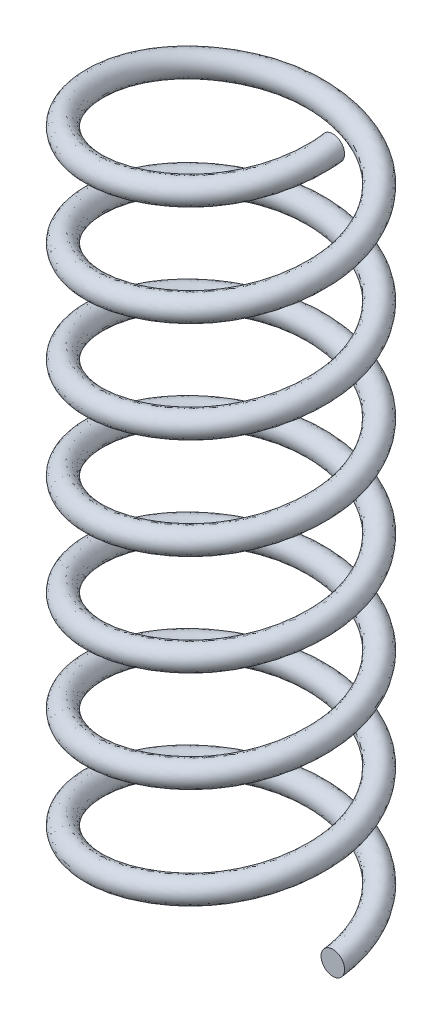
ISO-10303-21;
HEADER;
FILE_DESCRIPTION(('STEP AP214'),'2;1');
FILE_NAME('part.step','',(''),(''),'','','');
FILE_SCHEMA(('AUTOMOTIVE_DESIGN { 1 0 10303 214 1 1 1 1 }'));
ENDSEC;
DATA;
#1=APPLICATION_CONTEXT('core data for automotive mechanical design processes');
#2=APPLICATION_PROTOCOL_DEFINITION('international standard','automotive_design',2000,#1);
#3=PRODUCT_CONTEXT('',#1,'mechanical');
#4=PRODUCT('Part','Part','',(#3));
#5=PRODUCT_RELATED_PRODUCT_CATEGORY('part','',(#4));
#6=PRODUCT_DEFINITION_FORMATION('','',#4);
#7=PRODUCT_DEFINITION_CONTEXT('part definition',#1,'design');
#8=PRODUCT_DEFINITION('design','',#6,#7);
#9=PRODUCT_DEFINITION_SHAPE('','',#8);
#10=(LENGTH_UNIT() NAMED_UNIT(*) SI_UNIT(.MILLI.,.METRE.));
#11=(NAMED_UNIT(*) PLANE_ANGLE_UNIT() SI_UNIT($,.RADIAN.));
#12=(NAMED_UNIT(*) SI_UNIT($,.STERADIAN.) SOLID_ANGLE_UNIT());
#13=UNCERTAINTY_MEASURE_WITH_UNIT(LENGTH_MEASURE(1.E-05),#10,'distance_accuracy_value','');
#14=(GEOMETRIC_REPRESENTATION_CONTEXT(3) GLOBAL_UNCERTAINTY_ASSIGNED_CONTEXT((#13)) GLOBAL_UNIT_ASSIGNED_CONTEXT((#10,
#11,#12)) REPRESENTATION_CONTEXT('',''));
#15=CARTESIAN_POINT('',(0.,0.,0.));
#16=DIRECTION('',(0.,0.,1.));
#17=DIRECTION('',(1.,0.,0.));
#18=AXIS2_PLACEMENT_3D('',#15,#16,#17);
#19=CARTESIAN_POINT('',(4.75,0.,0.));
#20=DIRECTION('',(0.,0.,1.));
#21=DIRECTION('',(1.,0.,0.));
#22=AXIS2_PLACEMENT_3D('',#19,#20,#21);
#23=PLANE('',#22);
#24=CARTESIAN_POINT('',(4.75,0.,0.));
#25=DIRECTION('',(0.,0.,1.));
#26=DIRECTION('',(1.,0.,0.));
#27=AXIS2_PLACEMENT_3D('',#24,#25,#26);
#28=CIRCLE('',#27,0.5);
#29=CARTESIAN_POINT('',(5.25,0.,0.));
#30=VERTEX_POINT('',#29);
#31=EDGE_CURVE('E40',#30,#30,#28,.T.);
#32=ORIENTED_EDGE('',*,*,#31,.T.);
#33=EDGE_LOOP('',(#32));
#34=FACE_BOUND('',#33,.T.);
#35=ADVANCED_FACE('F33',(#34),#23,.T.);
#36=CARTESIAN_POINT('',(4.75,30.,-4.64367018066137E-13));
#37=DIRECTION('',(0.,0.,1.));
#38=DIRECTION('',(1.,0.,0.));
#39=AXIS2_PLACEMENT_3D('',#36,#37,#38);
#40=PLANE('',#39);
#41=CARTESIAN_POINT('',(4.75,30.,-4.64367018066137E-13));
#42=DIRECTION('',(0.,0.,1.));
#43=DIRECTION('',(1.,0.,0.));
#44=AXIS2_PLACEMENT_3D('',#41,#42,#43);
#45=CIRCLE('',#44,0.5);
#46=CARTESIAN_POINT('',(5.25,30.,-5.13247756809941E-13));
#47=VERTEX_POINT('',#46);
#48=EDGE_CURVE('E11',#47,#47,#45,.T.);
#49=ORIENTED_EDGE('',*,*,#48,.F.);
#50=EDGE_LOOP('',(#49));
#51=FACE_BOUND('',#50,.T.);
#52=ADVANCED_FACE('F49',(#51),#40,.F.);
#53=CARTESIAN_POINT('',(5.25,0.,0.));
#54=CARTESIAN_POINT('',(5.25,0.357142857142856,-3.03108891324553));
#55=CARTESIAN_POINT('',(2.625,0.714285714285712,-4.5466333698683));
#56=CARTESIAN_POINT('',(0.,1.07142857142857,-6.06217782649107));
#57=CARTESIAN_POINT('',(-2.625,1.42857142857142,-4.5466333698683));
#58=CARTESIAN_POINT('',(-5.25,1.78571428571428,-3.03108891324554));
#59=CARTESIAN_POINT('',(-5.25,2.14285714285714,0.));
#60=CARTESIAN_POINT('',(-5.25,2.49999999999999,3.03108891324553));
#61=CARTESIAN_POINT('',(-2.625,2.85714285714285,4.5466333698683));
#62=CARTESIAN_POINT('',(0.,3.2142857142857,6.06217782649107));
#63=CARTESIAN_POINT('',(2.625,3.57142857142856,4.5466333698683));
#64=CARTESIAN_POINT('',(5.25,3.92857142857142,3.03108891324554));
#65=CARTESIAN_POINT('',(5.25,4.28571428571427,0.));
#66=CARTESIAN_POINT('',(5.25,4.64285714285713,-3.03108891324553));
#67=CARTESIAN_POINT('',(2.625,4.99999999999998,-4.5466333698683));
#68=CARTESIAN_POINT('',(0.,5.35714285714284,-6.06217782649107));
#69=CARTESIAN_POINT('',(-2.625,5.7142857142857,-4.5466333698683));
#70=CARTESIAN_POINT('',(-5.25,6.07142857142855,-3.03108891324554));
#71=CARTESIAN_POINT('',(-5.25,6.42857142857141,0.));
#72=CARTESIAN_POINT('',(-5.25,6.78571428571426,3.03108891324553));
#73=CARTESIAN_POINT('',(-2.625,7.14285714285712,4.5466333698683));
#74=CARTESIAN_POINT('',(0.,7.49999999999998,6.06217782649107));
#75=CARTESIAN_POINT('',(2.625,7.85714285714283,4.5466333698683));
#76=CARTESIAN_POINT('',(5.25,8.21428571428569,3.03108891324554));
#77=CARTESIAN_POINT('',(5.25,8.57142857142854,0.));
#78=CARTESIAN_POINT('',(5.25,8.9285714285714,-3.03108891324553));
#79=CARTESIAN_POINT('',(2.625,9.28571428571426,-4.5466333698683));
#80=CARTESIAN_POINT('',(0.,9.64285714285711,-6.06217782649107));
#81=CARTESIAN_POINT('',(-2.625,9.99999999999997,-4.5466333698683));
#82=CARTESIAN_POINT('',(-5.25,10.3571428571428,-3.03108891324554));
#83=CARTESIAN_POINT('',(-5.25,10.7142857142857,0.));
#84=CARTESIAN_POINT('',(-5.25,11.0714285714285,3.03108891324553));
#85=CARTESIAN_POINT('',(-2.625,11.4285714285714,4.5466333698683));
#86=CARTESIAN_POINT('',(0.,11.7857142857142,6.06217782649107));
#87=CARTESIAN_POINT('',(2.625,12.1428571428571,4.5466333698683));
#88=CARTESIAN_POINT('',(5.25,12.5,3.03108891324554));
#89=CARTESIAN_POINT('',(5.25,12.8571428571428,0.));
#90=CARTESIAN_POINT('',(5.25,13.2142857142857,-3.03108891324553));
#91=CARTESIAN_POINT('',(2.625,13.5714285714285,-4.5466333698683));
#92=CARTESIAN_POINT('',(0.,13.9285714285714,-6.06217782649107));
#93=CARTESIAN_POINT('',(-2.625,14.2857142857142,-4.5466333698683));
#94=CARTESIAN_POINT('',(-5.25,14.6428571428571,-3.03108891324554));
#95=CARTESIAN_POINT('',(-5.25,15.,0.));
#96=CARTESIAN_POINT('',(-5.25,15.3571428571428,3.03108891324553));
#97=CARTESIAN_POINT('',(-2.625,15.7142857142857,4.5466333698683));
#98=CARTESIAN_POINT('',(0.,16.0714285714285,6.06217782649107));
#99=CARTESIAN_POINT('',(2.625,16.4285714285714,4.5466333698683));
#100=CARTESIAN_POINT('',(5.25,16.7857142857142,3.03108891324554));
#101=CARTESIAN_POINT('',(5.25,17.1428571428571,0.));
#102=CARTESIAN_POINT('',(5.25,17.4999999999999,-3.03108891324553));
#103=CARTESIAN_POINT('',(2.625,17.8571428571428,-4.5466333698683));
#104=CARTESIAN_POINT('',(0.,18.2142857142857,-6.06217782649107));
#105=CARTESIAN_POINT('',(-2.625,18.5714285714285,-4.5466333698683));
#106=CARTESIAN_POINT('',(-5.25,18.9285714285714,-3.03108891324554));
#107=CARTESIAN_POINT('',(-5.25,19.2857142857142,0.));
#108=CARTESIAN_POINT('',(-5.25,19.6428571428571,3.03108891324553));
#109=CARTESIAN_POINT('',(-2.625,19.9999999999999,4.5466333698683));
#110=CARTESIAN_POINT('',(0.,20.3571428571428,6.06217782649107));
#111=CARTESIAN_POINT('',(2.625,20.7142857142856,4.5466333698683));
#112=CARTESIAN_POINT('',(5.25,21.0714285714285,3.03108891324554));
#113=CARTESIAN_POINT('',(5.25,21.4285714285714,0.));
#114=CARTESIAN_POINT('',(5.25,21.7857142857142,-3.03108891324553));
#115=CARTESIAN_POINT('',(2.625,22.1428571428571,-4.5466333698683));
#116=CARTESIAN_POINT('',(0.,22.4999999999999,-6.06217782649107));
#117=CARTESIAN_POINT('',(-2.625,22.8571428571428,-4.5466333698683));
#118=CARTESIAN_POINT('',(-5.25,23.2142857142856,-3.03108891324554));
#119=CARTESIAN_POINT('',(-5.25,23.5714285714285,0.));
#120=CARTESIAN_POINT('',(-5.25,23.9285714285714,3.03108891324553));
#121=CARTESIAN_POINT('',(-2.625,24.2857142857142,4.5466333698683));
#122=CARTESIAN_POINT('',(0.,24.6428571428571,6.06217782649107));
#123=CARTESIAN_POINT('',(2.625,24.9999999999999,4.5466333698683));
#124=CARTESIAN_POINT('',(5.25,25.3571428571428,3.03108891324554));
#125=CARTESIAN_POINT('',(5.25,25.7142857142856,0.));
#126=CARTESIAN_POINT('',(5.25,26.0714285714285,-3.03108891324553));
#127=CARTESIAN_POINT('',(2.625,26.4285714285713,-4.5466333698683));
#128=CARTESIAN_POINT('',(0.,26.7857142857142,-6.06217782649107));
#129=CARTESIAN_POINT('',(-2.625,27.1428571428571,-4.5466333698683));
#130=CARTESIAN_POINT('',(-5.25,27.4999999999999,-3.03108891324554));
#131=CARTESIAN_POINT('',(-5.25,27.8571428571428,0.));
#132=CARTESIAN_POINT('',(-5.25,28.2142857142856,3.03108891324553));
#133=CARTESIAN_POINT('',(-2.625,28.5714285714285,4.5466333698683));
#134=CARTESIAN_POINT('',(0.,28.9285714285713,6.06217782649107));
#135=CARTESIAN_POINT('',(2.625,29.2857142857142,4.5466333698683));
#136=CARTESIAN_POINT('',(5.25,29.642857142857,3.03108891324554));
#137=CARTESIAN_POINT('',(5.25,29.9999999999999,0.));
#138=CARTESIAN_POINT('',(5.25,0.999999999999999,0.));
#139=CARTESIAN_POINT('',(5.25,1.35714285714286,-3.03108891324553));
#140=CARTESIAN_POINT('',(2.625,1.71428571428571,-4.5466333698683));
#141=CARTESIAN_POINT('',(0.,2.07142857142857,-6.06217782649107));
#142=CARTESIAN_POINT('',(-2.625,2.42857142857142,-4.5466333698683));
#143=CARTESIAN_POINT('',(-5.25,2.78571428571428,-3.03108891324554));
#144=CARTESIAN_POINT('',(-5.25,3.14285714285714,0.));
#145=CARTESIAN_POINT('',(-5.25,3.49999999999999,3.03108891324553));
#146=CARTESIAN_POINT('',(-2.625,3.85714285714285,4.5466333698683));
#147=CARTESIAN_POINT('',(0.,4.2142857142857,6.06217782649107));
#148=CARTESIAN_POINT('',(2.625,4.57142857142856,4.5466333698683));
#149=CARTESIAN_POINT('',(5.25,4.92857142857142,3.03108891324554));
#150=CARTESIAN_POINT('',(5.25,5.28571428571427,0.));
#151=CARTESIAN_POINT('',(5.25,5.64285714285713,-3.03108891324553));
#152=CARTESIAN_POINT('',(2.625,5.99999999999998,-4.5466333698683));
#153=CARTESIAN_POINT('',(0.,6.35714285714284,-6.06217782649107));
#154=CARTESIAN_POINT('',(-2.625,6.7142857142857,-4.5466333698683));
#155=CARTESIAN_POINT('',(-5.25,7.07142857142855,-3.03108891324554));
#156=CARTESIAN_POINT('',(-5.25,7.42857142857141,0.));
#157=CARTESIAN_POINT('',(-5.25,7.78571428571426,3.03108891324553));
#158=CARTESIAN_POINT('',(-2.625,8.14285714285712,4.5466333698683));
#159=CARTESIAN_POINT('',(0.,8.49999999999998,6.06217782649107));
#160=CARTESIAN_POINT('',(2.625,8.85714285714283,4.5466333698683));
#161=CARTESIAN_POINT('',(5.25,9.21428571428569,3.03108891324554));
#162=CARTESIAN_POINT('',(5.25,9.57142857142854,0.));
#163=CARTESIAN_POINT('',(5.25,9.9285714285714,-3.03108891324553));
#164=CARTESIAN_POINT('',(2.625,10.2857142857143,-4.5466333698683));
#165=CARTESIAN_POINT('',(0.,10.6428571428571,-6.06217782649107));
#166=CARTESIAN_POINT('',(-2.625,11.,-4.5466333698683));
#167=CARTESIAN_POINT('',(-5.25,11.3571428571428,-3.03108891324554));
#168=CARTESIAN_POINT('',(-5.25,11.7142857142857,0.));
#169=CARTESIAN_POINT('',(-5.25,12.0714285714285,3.03108891324553));
#170=CARTESIAN_POINT('',(-2.625,12.4285714285714,4.5466333698683));
#171=CARTESIAN_POINT('',(0.,12.7857142857142,6.06217782649107));
#172=CARTESIAN_POINT('',(2.625,13.1428571428571,4.5466333698683));
#173=CARTESIAN_POINT('',(5.25,13.5,3.03108891324554));
#174=CARTESIAN_POINT('',(5.25,13.8571428571428,0.));
#175=CARTESIAN_POINT('',(5.25,14.2142857142857,-3.03108891324553));
#176=CARTESIAN_POINT('',(2.625,14.5714285714285,-4.5466333698683));
#177=CARTESIAN_POINT('',(0.,14.9285714285714,-6.06217782649107));
#178=CARTESIAN_POINT('',(-2.625,15.2857142857142,-4.5466333698683));
#179=CARTESIAN_POINT('',(-5.25,15.6428571428571,-3.03108891324554));
#180=CARTESIAN_POINT('',(-5.25,16.,0.));
#181=CARTESIAN_POINT('',(-5.25,16.3571428571428,3.03108891324553));
#182=CARTESIAN_POINT('',(-2.625,16.7142857142857,4.5466333698683));
#183=CARTESIAN_POINT('',(0.,17.0714285714285,6.06217782649107));
#184=CARTESIAN_POINT('',(2.625,17.4285714285714,4.5466333698683));
#185=CARTESIAN_POINT('',(5.25,17.7857142857142,3.03108891324554));
#186=CARTESIAN_POINT('',(5.25,18.1428571428571,0.));
#187=CARTESIAN_POINT('',(5.25,18.4999999999999,-3.03108891324553));
#188=CARTESIAN_POINT('',(2.625,18.8571428571428,-4.5466333698683));
#189=CARTESIAN_POINT('',(0.,19.2142857142857,-6.06217782649107));
#190=CARTESIAN_POINT('',(-2.625,19.5714285714285,-4.5466333698683));
#191=CARTESIAN_POINT('',(-5.25,19.9285714285714,-3.03108891324554));
#192=CARTESIAN_POINT('',(-5.25,20.2857142857142,0.));
#193=CARTESIAN_POINT('',(-5.25,20.6428571428571,3.03108891324553));
#194=CARTESIAN_POINT('',(-2.625,20.9999999999999,4.5466333698683));
#195=CARTESIAN_POINT('',(0.,21.3571428571428,6.06217782649107));
#196=CARTESIAN_POINT('',(2.625,21.7142857142856,4.5466333698683));
#197=CARTESIAN_POINT('',(5.25,22.0714285714285,3.03108891324554));
#198=CARTESIAN_POINT('',(5.25,22.4285714285714,0.));
#199=CARTESIAN_POINT('',(5.25,22.7857142857142,-3.03108891324553));
#200=CARTESIAN_POINT('',(2.625,23.1428571428571,-4.5466333698683));
#201=CARTESIAN_POINT('',(0.,23.4999999999999,-6.06217782649107));
#202=CARTESIAN_POINT('',(-2.625,23.8571428571428,-4.5466333698683));
#203=CARTESIAN_POINT('',(-5.25,24.2142857142856,-3.03108891324554));
#204=CARTESIAN_POINT('',(-5.25,24.5714285714285,0.));
#205=CARTESIAN_POINT('',(-5.25,24.9285714285714,3.03108891324553));
#206=CARTESIAN_POINT('',(-2.625,25.2857142857142,4.5466333698683));
#207=CARTESIAN_POINT('',(0.,25.6428571428571,6.06217782649107));
#208=CARTESIAN_POINT('',(2.625,25.9999999999999,4.5466333698683));
#209=CARTESIAN_POINT('',(5.25,26.3571428571428,3.03108891324554));
#210=CARTESIAN_POINT('',(5.25,26.7142857142856,0.));
#211=CARTESIAN_POINT('',(5.25,27.0714285714285,-3.03108891324553));
#212=CARTESIAN_POINT('',(2.625,27.4285714285713,-4.5466333698683));
#213=CARTESIAN_POINT('',(0.,27.7857142857142,-6.06217782649107));
#214=CARTESIAN_POINT('',(-2.625,28.1428571428571,-4.5466333698683));
#215=CARTESIAN_POINT('',(-5.25,28.4999999999999,-3.03108891324554));
#216=CARTESIAN_POINT('',(-5.25,28.8571428571428,0.));
#217=CARTESIAN_POINT('',(-5.25,29.2142857142856,3.03108891324553));
#218=CARTESIAN_POINT('',(-2.625,29.5714285714285,4.5466333698683));
#219=CARTESIAN_POINT('',(0.,29.9285714285713,6.06217782649107));
#220=CARTESIAN_POINT('',(2.625,30.2857142857142,4.5466333698683));
#221=CARTESIAN_POINT('',(5.25,30.642857142857,3.03108891324554));
#222=CARTESIAN_POINT('',(5.25,30.9999999999999,0.));
#223=CARTESIAN_POINT('',(4.25,0.999999999999999,0.));
#224=CARTESIAN_POINT('',(4.25,1.35714285714286,-2.45373864405591));
#225=CARTESIAN_POINT('',(2.125,1.71428571428571,-3.68060796608386));
#226=CARTESIAN_POINT('',(0.,2.07142857142857,-4.90747728811182));
#227=CARTESIAN_POINT('',(-2.125,2.42857142857142,-3.68060796608387));
#228=CARTESIAN_POINT('',(-4.25,2.78571428571428,-2.45373864405591));
#229=CARTESIAN_POINT('',(-4.25,3.14285714285714,0.));
#230=CARTESIAN_POINT('',(-4.25,3.49999999999999,2.45373864405591));
#231=CARTESIAN_POINT('',(-2.125,3.85714285714285,3.68060796608386));
#232=CARTESIAN_POINT('',(0.,4.2142857142857,4.90747728811182));
#233=CARTESIAN_POINT('',(2.125,4.57142857142856,3.68060796608387));
#234=CARTESIAN_POINT('',(4.25,4.92857142857142,2.45373864405591));
#235=CARTESIAN_POINT('',(4.25,5.28571428571427,0.));
#236=CARTESIAN_POINT('',(4.25,5.64285714285713,-2.45373864405591));
#237=CARTESIAN_POINT('',(2.125,5.99999999999998,-3.68060796608386));
#238=CARTESIAN_POINT('',(0.,6.35714285714284,-4.90747728811182));
#239=CARTESIAN_POINT('',(-2.125,6.7142857142857,-3.68060796608387));
#240=CARTESIAN_POINT('',(-4.25,7.07142857142855,-2.45373864405591));
#241=CARTESIAN_POINT('',(-4.25,7.42857142857141,0.));
#242=CARTESIAN_POINT('',(-4.25,7.78571428571426,2.45373864405591));
#243=CARTESIAN_POINT('',(-2.125,8.14285714285712,3.68060796608386));
#244=CARTESIAN_POINT('',(0.,8.49999999999998,4.90747728811182));
#245=CARTESIAN_POINT('',(2.125,8.85714285714283,3.68060796608387));
#246=CARTESIAN_POINT('',(4.25,9.21428571428569,2.45373864405591));
#247=CARTESIAN_POINT('',(4.25,9.57142857142854,0.));
#248=CARTESIAN_POINT('',(4.25,9.9285714285714,-2.45373864405591));
#249=CARTESIAN_POINT('',(2.125,10.2857142857143,-3.68060796608386));
#250=CARTESIAN_POINT('',(0.,10.6428571428571,-4.90747728811182));
#251=CARTESIAN_POINT('',(-2.125,11.,-3.68060796608387));
#252=CARTESIAN_POINT('',(-4.25,11.3571428571428,-2.45373864405591));
#253=CARTESIAN_POINT('',(-4.25,11.7142857142857,0.));
#254=CARTESIAN_POINT('',(-4.25,12.0714285714285,2.45373864405591));
#255=CARTESIAN_POINT('',(-2.125,12.4285714285714,3.68060796608386));
#256=CARTESIAN_POINT('',(0.,12.7857142857142,4.90747728811182));
#257=CARTESIAN_POINT('',(2.125,13.1428571428571,3.68060796608387));
#258=CARTESIAN_POINT('',(4.25,13.5,2.45373864405591));
#259=CARTESIAN_POINT('',(4.25,13.8571428571428,0.));
#260=CARTESIAN_POINT('',(4.25,14.2142857142857,-2.45373864405591));
#261=CARTESIAN_POINT('',(2.125,14.5714285714285,-3.68060796608386));
#262=CARTESIAN_POINT('',(0.,14.9285714285714,-4.90747728811182));
#263=CARTESIAN_POINT('',(-2.125,15.2857142857142,-3.68060796608387));
#264=CARTESIAN_POINT('',(-4.25,15.6428571428571,-2.45373864405591));
#265=CARTESIAN_POINT('',(-4.25,16.,0.));
#266=CARTESIAN_POINT('',(-4.25,16.3571428571428,2.45373864405591));
#267=CARTESIAN_POINT('',(-2.125,16.7142857142857,3.68060796608386));
#268=CARTESIAN_POINT('',(0.,17.0714285714285,4.90747728811182));
#269=CARTESIAN_POINT('',(2.125,17.4285714285714,3.68060796608387));
#270=CARTESIAN_POINT('',(4.25,17.7857142857142,2.45373864405591));
#271=CARTESIAN_POINT('',(4.25,18.1428571428571,0.));
#272=CARTESIAN_POINT('',(4.25,18.4999999999999,-2.45373864405591));
#273=CARTESIAN_POINT('',(2.125,18.8571428571428,-3.68060796608386));
#274=CARTESIAN_POINT('',(0.,19.2142857142857,-4.90747728811182));
#275=CARTESIAN_POINT('',(-2.125,19.5714285714285,-3.68060796608387));
#276=CARTESIAN_POINT('',(-4.25,19.9285714285714,-2.45373864405591));
#277=CARTESIAN_POINT('',(-4.25,20.2857142857142,0.));
#278=CARTESIAN_POINT('',(-4.25,20.6428571428571,2.45373864405591));
#279=CARTESIAN_POINT('',(-2.125,20.9999999999999,3.68060796608386));
#280=CARTESIAN_POINT('',(0.,21.3571428571428,4.90747728811182));
#281=CARTESIAN_POINT('',(2.125,21.7142857142856,3.68060796608387));
#282=CARTESIAN_POINT('',(4.25,22.0714285714285,2.45373864405591));
#283=CARTESIAN_POINT('',(4.25,22.4285714285714,0.));
#284=CARTESIAN_POINT('',(4.25,22.7857142857142,-2.45373864405591));
#285=CARTESIAN_POINT('',(2.125,23.1428571428571,-3.68060796608386));
#286=CARTESIAN_POINT('',(0.,23.4999999999999,-4.90747728811182));
#287=CARTESIAN_POINT('',(-2.125,23.8571428571428,-3.68060796608387));
#288=CARTESIAN_POINT('',(-4.25,24.2142857142856,-2.45373864405591));
#289=CARTESIAN_POINT('',(-4.25,24.5714285714285,0.));
#290=CARTESIAN_POINT('',(-4.25,24.9285714285714,2.45373864405591));
#291=CARTESIAN_POINT('',(-2.125,25.2857142857142,3.68060796608386));
#292=CARTESIAN_POINT('',(0.,25.6428571428571,4.90747728811182));
#293=CARTESIAN_POINT('',(2.125,25.9999999999999,3.68060796608387));
#294=CARTESIAN_POINT('',(4.25,26.3571428571428,2.45373864405591));
#295=CARTESIAN_POINT('',(4.25,26.7142857142856,0.));
#296=CARTESIAN_POINT('',(4.25,27.0714285714285,-2.45373864405591));
#297=CARTESIAN_POINT('',(2.125,27.4285714285713,-3.68060796608386));
#298=CARTESIAN_POINT('',(0.,27.7857142857142,-4.90747728811182));
#299=CARTESIAN_POINT('',(-2.125,28.1428571428571,-3.68060796608387));
#300=CARTESIAN_POINT('',(-4.25,28.4999999999999,-2.45373864405591));
#301=CARTESIAN_POINT('',(-4.25,28.8571428571428,0.));
#302=CARTESIAN_POINT('',(-4.25,29.2142857142856,2.45373864405591));
#303=CARTESIAN_POINT('',(-2.125,29.5714285714285,3.68060796608386));
#304=CARTESIAN_POINT('',(0.,29.9285714285713,4.90747728811182));
#305=CARTESIAN_POINT('',(2.125,30.2857142857142,3.68060796608387));
#306=CARTESIAN_POINT('',(4.25,30.642857142857,2.45373864405591));
#307=CARTESIAN_POINT('',(4.25,30.9999999999999,0.));
#308=CARTESIAN_POINT('',(4.25,0.,0.));
#309=CARTESIAN_POINT('',(4.25,0.357142857142856,-2.45373864405591));
#310=CARTESIAN_POINT('',(2.125,0.714285714285712,-3.68060796608386));
#311=CARTESIAN_POINT('',(0.,1.07142857142857,-4.90747728811182));
#312=CARTESIAN_POINT('',(-2.125,1.42857142857142,-3.68060796608386));
#313=CARTESIAN_POINT('',(-4.25,1.78571428571428,-2.45373864405591));
#314=CARTESIAN_POINT('',(-4.25,2.14285714285714,0.));
#315=CARTESIAN_POINT('',(-4.25,2.49999999999999,2.45373864405591));
#316=CARTESIAN_POINT('',(-2.125,2.85714285714285,3.68060796608386));
#317=CARTESIAN_POINT('',(0.,3.2142857142857,4.90747728811182));
#318=CARTESIAN_POINT('',(2.125,3.57142857142856,3.68060796608387));
#319=CARTESIAN_POINT('',(4.25,3.92857142857142,2.45373864405591));
#320=CARTESIAN_POINT('',(4.25,4.28571428571427,0.));
#321=CARTESIAN_POINT('',(4.25,4.64285714285713,-2.45373864405591));
#322=CARTESIAN_POINT('',(2.125,4.99999999999998,-3.68060796608386));
#323=CARTESIAN_POINT('',(0.,5.35714285714284,-4.90747728811182));
#324=CARTESIAN_POINT('',(-2.125,5.7142857142857,-3.68060796608386));
#325=CARTESIAN_POINT('',(-4.25,6.07142857142855,-2.45373864405591));
#326=CARTESIAN_POINT('',(-4.25,6.42857142857141,0.));
#327=CARTESIAN_POINT('',(-4.25,6.78571428571426,2.45373864405591));
#328=CARTESIAN_POINT('',(-2.125,7.14285714285712,3.68060796608386));
#329=CARTESIAN_POINT('',(0.,7.49999999999998,4.90747728811182));
#330=CARTESIAN_POINT('',(2.125,7.85714285714283,3.68060796608387));
#331=CARTESIAN_POINT('',(4.25,8.21428571428569,2.45373864405591));
#332=CARTESIAN_POINT('',(4.25,8.57142857142854,0.));
#333=CARTESIAN_POINT('',(4.25,8.9285714285714,-2.45373864405591));
#334=CARTESIAN_POINT('',(2.125,9.28571428571426,-3.68060796608386));
#335=CARTESIAN_POINT('',(0.,9.64285714285711,-4.90747728811182));
#336=CARTESIAN_POINT('',(-2.125,9.99999999999997,-3.68060796608386));
#337=CARTESIAN_POINT('',(-4.25,10.3571428571428,-2.45373864405591));
#338=CARTESIAN_POINT('',(-4.25,10.7142857142857,0.));
#339=CARTESIAN_POINT('',(-4.25,11.0714285714285,2.45373864405591));
#340=CARTESIAN_POINT('',(-2.125,11.4285714285714,3.68060796608386));
#341=CARTESIAN_POINT('',(0.,11.7857142857142,4.90747728811182));
#342=CARTESIAN_POINT('',(2.125,12.1428571428571,3.68060796608387));
#343=CARTESIAN_POINT('',(4.25,12.5,2.45373864405591));
#344=CARTESIAN_POINT('',(4.25,12.8571428571428,0.));
#345=CARTESIAN_POINT('',(4.25,13.2142857142857,-2.45373864405591));
#346=CARTESIAN_POINT('',(2.125,13.5714285714285,-3.68060796608386));
#347=CARTESIAN_POINT('',(0.,13.9285714285714,-4.90747728811182));
#348=CARTESIAN_POINT('',(-2.125,14.2857142857142,-3.68060796608386));
#349=CARTESIAN_POINT('',(-4.25,14.6428571428571,-2.45373864405591));
#350=CARTESIAN_POINT('',(-4.25,15.,0.));
#351=CARTESIAN_POINT('',(-4.25,15.3571428571428,2.45373864405591));
#352=CARTESIAN_POINT('',(-2.125,15.7142857142857,3.68060796608386));
#353=CARTESIAN_POINT('',(0.,16.0714285714285,4.90747728811182));
#354=CARTESIAN_POINT('',(2.125,16.4285714285714,3.68060796608387));
#355=CARTESIAN_POINT('',(4.25,16.7857142857142,2.45373864405591));
#356=CARTESIAN_POINT('',(4.25,17.1428571428571,0.));
#357=CARTESIAN_POINT('',(4.25,17.4999999999999,-2.45373864405591));
#358=CARTESIAN_POINT('',(2.125,17.8571428571428,-3.68060796608386));
#359=CARTESIAN_POINT('',(0.,18.2142857142857,-4.90747728811182));
#360=CARTESIAN_POINT('',(-2.125,18.5714285714285,-3.68060796608386));
#361=CARTESIAN_POINT('',(-4.25,18.9285714285714,-2.45373864405591));
#362=CARTESIAN_POINT('',(-4.25,19.2857142857142,0.));
#363=CARTESIAN_POINT('',(-4.25,19.6428571428571,2.45373864405591));
#364=CARTESIAN_POINT('',(-2.125,19.9999999999999,3.68060796608386));
#365=CARTESIAN_POINT('',(0.,20.3571428571428,4.90747728811182));
#366=CARTESIAN_POINT('',(2.125,20.7142857142856,3.68060796608387));
#367=CARTESIAN_POINT('',(4.25,21.0714285714285,2.45373864405591));
#368=CARTESIAN_POINT('',(4.25,21.4285714285714,0.));
#369=CARTESIAN_POINT('',(4.25,21.7857142857142,-2.45373864405591));
#370=CARTESIAN_POINT('',(2.125,22.1428571428571,-3.68060796608386));
#371=CARTESIAN_POINT('',(0.,22.4999999999999,-4.90747728811182));
#372=CARTESIAN_POINT('',(-2.125,22.8571428571428,-3.68060796608386));
#373=CARTESIAN_POINT('',(-4.25,23.2142857142856,-2.45373864405591));
#374=CARTESIAN_POINT('',(-4.25,23.5714285714285,0.));
#375=CARTESIAN_POINT('',(-4.25,23.9285714285714,2.45373864405591));
#376=CARTESIAN_POINT('',(-2.125,24.2857142857142,3.68060796608386));
#377=CARTESIAN_POINT('',(0.,24.6428571428571,4.90747728811182));
#378=CARTESIAN_POINT('',(2.125,24.9999999999999,3.68060796608387));
#379=CARTESIAN_POINT('',(4.25,25.3571428571428,2.45373864405591));
#380=CARTESIAN_POINT('',(4.25,25.7142857142856,0.));
#381=CARTESIAN_POINT('',(4.25,26.0714285714285,-2.45373864405591));
#382=CARTESIAN_POINT('',(2.125,26.4285714285713,-3.68060796608386));
#383=CARTESIAN_POINT('',(0.,26.7857142857142,-4.90747728811182));
#384=CARTESIAN_POINT('',(-2.125,27.1428571428571,-3.68060796608386));
#385=CARTESIAN_POINT('',(-4.25,27.4999999999999,-2.45373864405591));
#386=CARTESIAN_POINT('',(-4.25,27.8571428571428,0.));
#387=CARTESIAN_POINT('',(-4.25,28.2142857142856,2.45373864405591));
#388=CARTESIAN_POINT('',(-2.125,28.5714285714285,3.68060796608386));
#389=CARTESIAN_POINT('',(0.,28.9285714285713,4.90747728811182));
#390=CARTESIAN_POINT('',(2.125,29.2857142857142,3.68060796608387));
#391=CARTESIAN_POINT('',(4.25,29.642857142857,2.45373864405591));
#392=CARTESIAN_POINT('',(4.25,29.9999999999999,0.));
#393=CARTESIAN_POINT('',(4.25,-0.999999999999999,0.));
#394=CARTESIAN_POINT('',(4.25,-0.642857142857143,-2.45373864405591));
#395=CARTESIAN_POINT('',(2.125,-0.285714285714287,-3.68060796608386));
#396=CARTESIAN_POINT('',(0.,0.0714285714285686,-4.90747728811182));
#397=CARTESIAN_POINT('',(-2.125,0.428571428571425,-3.68060796608387));
#398=CARTESIAN_POINT('',(-4.25,0.785714285714281,-2.45373864405591));
#399=CARTESIAN_POINT('',(-4.25,1.14285714285714,0.));
#400=CARTESIAN_POINT('',(-4.25,1.49999999999999,2.45373864405591));
#401=CARTESIAN_POINT('',(-2.125,1.85714285714285,3.68060796608386));
#402=CARTESIAN_POINT('',(0.,2.21428571428571,4.90747728811182));
#403=CARTESIAN_POINT('',(2.125,2.57142857142856,3.68060796608387));
#404=CARTESIAN_POINT('',(4.25,2.92857142857142,2.45373864405591));
#405=CARTESIAN_POINT('',(4.25,3.28571428571427,0.));
#406=CARTESIAN_POINT('',(4.25,3.64285714285713,-2.45373864405591));
#407=CARTESIAN_POINT('',(2.125,3.99999999999998,-3.68060796608386));
#408=CARTESIAN_POINT('',(0.,4.35714285714284,-4.90747728811182));
#409=CARTESIAN_POINT('',(-2.125,4.7142857142857,-3.68060796608387));
#410=CARTESIAN_POINT('',(-4.25,5.07142857142855,-2.45373864405591));
#411=CARTESIAN_POINT('',(-4.25,5.42857142857141,0.));
#412=CARTESIAN_POINT('',(-4.25,5.78571428571427,2.45373864405591));
#413=CARTESIAN_POINT('',(-2.125,6.14285714285712,3.68060796608386));
#414=CARTESIAN_POINT('',(0.,6.49999999999998,4.90747728811182));
#415=CARTESIAN_POINT('',(2.125,6.85714285714283,3.68060796608387));
#416=CARTESIAN_POINT('',(4.25,7.21428571428569,2.45373864405591));
#417=CARTESIAN_POINT('',(4.25,7.57142857142855,0.));
#418=CARTESIAN_POINT('',(4.25,7.9285714285714,-2.45373864405591));
#419=CARTESIAN_POINT('',(2.125,8.28571428571426,-3.68060796608386));
#420=CARTESIAN_POINT('',(0.,8.64285714285711,-4.90747728811182));
#421=CARTESIAN_POINT('',(-2.125,8.99999999999997,-3.68060796608387));
#422=CARTESIAN_POINT('',(-4.25,9.35714285714282,-2.45373864405591));
#423=CARTESIAN_POINT('',(-4.25,9.71428571428568,0.));
#424=CARTESIAN_POINT('',(-4.25,10.0714285714285,2.45373864405591));
#425=CARTESIAN_POINT('',(-2.125,10.4285714285714,3.68060796608386));
#426=CARTESIAN_POINT('',(0.,10.7857142857142,4.90747728811182));
#427=CARTESIAN_POINT('',(2.125,11.1428571428571,3.68060796608387));
#428=CARTESIAN_POINT('',(4.25,11.5,2.45373864405591));
#429=CARTESIAN_POINT('',(4.25,11.8571428571428,0.));
#430=CARTESIAN_POINT('',(4.25,12.2142857142857,-2.45373864405591));
#431=CARTESIAN_POINT('',(2.125,12.5714285714285,-3.68060796608386));
#432=CARTESIAN_POINT('',(0.,12.9285714285714,-4.90747728811182));
#433=CARTESIAN_POINT('',(-2.125,13.2857142857142,-3.68060796608387));
#434=CARTESIAN_POINT('',(-4.25,13.6428571428571,-2.45373864405591));
#435=CARTESIAN_POINT('',(-4.25,14.,0.));
#436=CARTESIAN_POINT('',(-4.25,14.3571428571428,2.45373864405591));
#437=CARTESIAN_POINT('',(-2.125,14.7142857142857,3.68060796608386));
#438=CARTESIAN_POINT('',(0.,15.0714285714285,4.90747728811182));
#439=CARTESIAN_POINT('',(2.125,15.4285714285714,3.68060796608387));
#440=CARTESIAN_POINT('',(4.25,15.7857142857142,2.45373864405591));
#441=CARTESIAN_POINT('',(4.25,16.1428571428571,0.));
#442=CARTESIAN_POINT('',(4.25,16.4999999999999,-2.45373864405591));
#443=CARTESIAN_POINT('',(2.125,16.8571428571428,-3.68060796608386));
#444=CARTESIAN_POINT('',(0.,17.2142857142857,-4.90747728811182));
#445=CARTESIAN_POINT('',(-2.125,17.5714285714285,-3.68060796608387));
#446=CARTESIAN_POINT('',(-4.25,17.9285714285714,-2.45373864405591));
#447=CARTESIAN_POINT('',(-4.25,18.2857142857142,0.));
#448=CARTESIAN_POINT('',(-4.25,18.6428571428571,2.45373864405591));
#449=CARTESIAN_POINT('',(-2.125,18.9999999999999,3.68060796608386));
#450=CARTESIAN_POINT('',(0.,19.3571428571428,4.90747728811182));
#451=CARTESIAN_POINT('',(2.125,19.7142857142856,3.68060796608387));
#452=CARTESIAN_POINT('',(4.25,20.0714285714285,2.45373864405591));
#453=CARTESIAN_POINT('',(4.25,20.4285714285714,0.));
#454=CARTESIAN_POINT('',(4.25,20.7857142857142,-2.45373864405591));
#455=CARTESIAN_POINT('',(2.125,21.1428571428571,-3.68060796608386));
#456=CARTESIAN_POINT('',(0.,21.4999999999999,-4.90747728811182));
#457=CARTESIAN_POINT('',(-2.125,21.8571428571428,-3.68060796608387));
#458=CARTESIAN_POINT('',(-4.25,22.2142857142856,-2.45373864405591));
#459=CARTESIAN_POINT('',(-4.25,22.5714285714285,0.));
#460=CARTESIAN_POINT('',(-4.25,22.9285714285714,2.45373864405591));
#461=CARTESIAN_POINT('',(-2.125,23.2857142857142,3.68060796608386));
#462=CARTESIAN_POINT('',(0.,23.6428571428571,4.90747728811182));
#463=CARTESIAN_POINT('',(2.125,23.9999999999999,3.68060796608387));
#464=CARTESIAN_POINT('',(4.25,24.3571428571428,2.45373864405591));
#465=CARTESIAN_POINT('',(4.25,24.7142857142856,0.));
#466=CARTESIAN_POINT('',(4.25,25.0714285714285,-2.45373864405591));
#467=CARTESIAN_POINT('',(2.125,25.4285714285713,-3.68060796608386));
#468=CARTESIAN_POINT('',(0.,25.7857142857142,-4.90747728811182));
#469=CARTESIAN_POINT('',(-2.125,26.1428571428571,-3.68060796608387));
#470=CARTESIAN_POINT('',(-4.25,26.4999999999999,-2.45373864405591));
#471=CARTESIAN_POINT('',(-4.25,26.8571428571428,0.));
#472=CARTESIAN_POINT('',(-4.25,27.2142857142856,2.45373864405591));
#473=CARTESIAN_POINT('',(-2.125,27.5714285714285,3.68060796608386));
#474=CARTESIAN_POINT('',(0.,27.9285714285713,4.90747728811182));
#475=CARTESIAN_POINT('',(2.125,28.2857142857142,3.68060796608387));
#476=CARTESIAN_POINT('',(4.25,28.642857142857,2.45373864405591));
#477=CARTESIAN_POINT('',(4.25,28.9999999999999,0.));
#478=CARTESIAN_POINT('',(5.25,-0.999999999999999,0.));
#479=CARTESIAN_POINT('',(5.25,-0.642857142857143,-3.03108891324553));
#480=CARTESIAN_POINT('',(2.625,-0.285714285714287,-4.5466333698683));
#481=CARTESIAN_POINT('',(0.,0.0714285714285686,-6.06217782649107));
#482=CARTESIAN_POINT('',(-2.625,0.428571428571425,-4.5466333698683));
#483=CARTESIAN_POINT('',(-5.25,0.785714285714281,-3.03108891324554));
#484=CARTESIAN_POINT('',(-5.25,1.14285714285714,0.));
#485=CARTESIAN_POINT('',(-5.25,1.49999999999999,3.03108891324553));
#486=CARTESIAN_POINT('',(-2.625,1.85714285714285,4.5466333698683));
#487=CARTESIAN_POINT('',(0.,2.21428571428571,6.06217782649107));
#488=CARTESIAN_POINT('',(2.625,2.57142857142856,4.5466333698683));
#489=CARTESIAN_POINT('',(5.25,2.92857142857142,3.03108891324554));
#490=CARTESIAN_POINT('',(5.25,3.28571428571427,0.));
#491=CARTESIAN_POINT('',(5.25,3.64285714285713,-3.03108891324553));
#492=CARTESIAN_POINT('',(2.625,3.99999999999998,-4.5466333698683));
#493=CARTESIAN_POINT('',(0.,4.35714285714284,-6.06217782649107));
#494=CARTESIAN_POINT('',(-2.625,4.7142857142857,-4.5466333698683));
#495=CARTESIAN_POINT('',(-5.25,5.07142857142855,-3.03108891324554));
#496=CARTESIAN_POINT('',(-5.25,5.42857142857141,0.));
#497=CARTESIAN_POINT('',(-5.25,5.78571428571427,3.03108891324553));
#498=CARTESIAN_POINT('',(-2.625,6.14285714285712,4.5466333698683));
#499=CARTESIAN_POINT('',(0.,6.49999999999998,6.06217782649107));
#500=CARTESIAN_POINT('',(2.625,6.85714285714283,4.5466333698683));
#501=CARTESIAN_POINT('',(5.25,7.21428571428569,3.03108891324554));
#502=CARTESIAN_POINT('',(5.25,7.57142857142855,0.));
#503=CARTESIAN_POINT('',(5.25,7.9285714285714,-3.03108891324553));
#504=CARTESIAN_POINT('',(2.625,8.28571428571426,-4.5466333698683));
#505=CARTESIAN_POINT('',(0.,8.64285714285711,-6.06217782649107));
#506=CARTESIAN_POINT('',(-2.625,8.99999999999997,-4.5466333698683));
#507=CARTESIAN_POINT('',(-5.25,9.35714285714282,-3.03108891324554));
#508=CARTESIAN_POINT('',(-5.25,9.71428571428568,0.));
#509=CARTESIAN_POINT('',(-5.25,10.0714285714285,3.03108891324553));
#510=CARTESIAN_POINT('',(-2.625,10.4285714285714,4.5466333698683));
#511=CARTESIAN_POINT('',(0.,10.7857142857142,6.06217782649107));
#512=CARTESIAN_POINT('',(2.625,11.1428571428571,4.5466333698683));
#513=CARTESIAN_POINT('',(5.25,11.5,3.03108891324554));
#514=CARTESIAN_POINT('',(5.25,11.8571428571428,0.));
#515=CARTESIAN_POINT('',(5.25,12.2142857142857,-3.03108891324553));
#516=CARTESIAN_POINT('',(2.625,12.5714285714285,-4.5466333698683));
#517=CARTESIAN_POINT('',(0.,12.9285714285714,-6.06217782649107));
#518=CARTESIAN_POINT('',(-2.625,13.2857142857142,-4.5466333698683));
#519=CARTESIAN_POINT('',(-5.25,13.6428571428571,-3.03108891324554));
#520=CARTESIAN_POINT('',(-5.25,14.,0.));
#521=CARTESIAN_POINT('',(-5.25,14.3571428571428,3.03108891324553));
#522=CARTESIAN_POINT('',(-2.625,14.7142857142857,4.5466333698683));
#523=CARTESIAN_POINT('',(0.,15.0714285714285,6.06217782649107));
#524=CARTESIAN_POINT('',(2.625,15.4285714285714,4.5466333698683));
#525=CARTESIAN_POINT('',(5.25,15.7857142857142,3.03108891324554));
#526=CARTESIAN_POINT('',(5.25,16.1428571428571,0.));
#527=CARTESIAN_POINT('',(5.25,16.4999999999999,-3.03108891324553));
#528=CARTESIAN_POINT('',(2.625,16.8571428571428,-4.5466333698683));
#529=CARTESIAN_POINT('',(0.,17.2142857142857,-6.06217782649107));
#530=CARTESIAN_POINT('',(-2.625,17.5714285714285,-4.5466333698683));
#531=CARTESIAN_POINT('',(-5.25,17.9285714285714,-3.03108891324554));
#532=CARTESIAN_POINT('',(-5.25,18.2857142857142,0.));
#533=CARTESIAN_POINT('',(-5.25,18.6428571428571,3.03108891324553));
#534=CARTESIAN_POINT('',(-2.625,18.9999999999999,4.5466333698683));
#535=CARTESIAN_POINT('',(0.,19.3571428571428,6.06217782649107));
#536=CARTESIAN_POINT('',(2.625,19.7142857142856,4.5466333698683));
#537=CARTESIAN_POINT('',(5.25,20.0714285714285,3.03108891324554));
#538=CARTESIAN_POINT('',(5.25,20.4285714285714,0.));
#539=CARTESIAN_POINT('',(5.25,20.7857142857142,-3.03108891324553));
#540=CARTESIAN_POINT('',(2.625,21.1428571428571,-4.5466333698683));
#541=CARTESIAN_POINT('',(0.,21.4999999999999,-6.06217782649107));
#542=CARTESIAN_POINT('',(-2.625,21.8571428571428,-4.5466333698683));
#543=CARTESIAN_POINT('',(-5.25,22.2142857142856,-3.03108891324554));
#544=CARTESIAN_POINT('',(-5.25,22.5714285714285,0.));
#545=CARTESIAN_POINT('',(-5.25,22.9285714285714,3.03108891324553));
#546=CARTESIAN_POINT('',(-2.625,23.2857142857142,4.5466333698683));
#547=CARTESIAN_POINT('',(0.,23.6428571428571,6.06217782649107));
#548=CARTESIAN_POINT('',(2.625,23.9999999999999,4.5466333698683));
#549=CARTESIAN_POINT('',(5.25,24.3571428571428,3.03108891324554));
#550=CARTESIAN_POINT('',(5.25,24.7142857142856,0.));
#551=CARTESIAN_POINT('',(5.25,25.0714285714285,-3.03108891324553));
#552=CARTESIAN_POINT('',(2.625,25.4285714285713,-4.5466333698683));
#553=CARTESIAN_POINT('',(0.,25.7857142857142,-6.06217782649107));
#554=CARTESIAN_POINT('',(-2.625,26.1428571428571,-4.5466333698683));
#555=CARTESIAN_POINT('',(-5.25,26.4999999999999,-3.03108891324554));
#556=CARTESIAN_POINT('',(-5.25,26.8571428571428,0.));
#557=CARTESIAN_POINT('',(-5.25,27.2142857142856,3.03108891324553));
#558=CARTESIAN_POINT('',(-2.625,27.5714285714285,4.5466333698683));
#559=CARTESIAN_POINT('',(0.,27.9285714285713,6.06217782649107));
#560=CARTESIAN_POINT('',(2.625,28.2857142857142,4.5466333698683));
#561=CARTESIAN_POINT('',(5.25,28.642857142857,3.03108891324554));
#562=CARTESIAN_POINT('',(5.25,28.9999999999999,0.));
#563=CARTESIAN_POINT('',(5.25,0.,0.));
#564=CARTESIAN_POINT('',(5.25,0.357142857142856,-3.03108891324553));
#565=CARTESIAN_POINT('',(2.625,0.714285714285712,-4.5466333698683));
#566=CARTESIAN_POINT('',(0.,1.07142857142857,-6.06217782649107));
#567=CARTESIAN_POINT('',(-2.625,1.42857142857142,-4.5466333698683));
#568=CARTESIAN_POINT('',(-5.25,1.78571428571428,-3.03108891324554));
#569=CARTESIAN_POINT('',(-5.25,2.14285714285714,0.));
#570=CARTESIAN_POINT('',(-5.25,2.49999999999999,3.03108891324553));
#571=CARTESIAN_POINT('',(-2.625,2.85714285714285,4.5466333698683));
#572=CARTESIAN_POINT('',(0.,3.2142857142857,6.06217782649107));
#573=CARTESIAN_POINT('',(2.625,3.57142857142856,4.5466333698683));
#574=CARTESIAN_POINT('',(5.25,3.92857142857142,3.03108891324554));
#575=CARTESIAN_POINT('',(5.25,4.28571428571427,0.));
#576=CARTESIAN_POINT('',(5.25,4.64285714285713,-3.03108891324553));
#577=CARTESIAN_POINT('',(2.625,4.99999999999998,-4.5466333698683));
#578=CARTESIAN_POINT('',(0.,5.35714285714284,-6.06217782649107));
#579=CARTESIAN_POINT('',(-2.625,5.7142857142857,-4.5466333698683));
#580=CARTESIAN_POINT('',(-5.25,6.07142857142855,-3.03108891324554));
#581=CARTESIAN_POINT('',(-5.25,6.42857142857141,0.));
#582=CARTESIAN_POINT('',(-5.25,6.78571428571426,3.03108891324553));
#583=CARTESIAN_POINT('',(-2.625,7.14285714285712,4.5466333698683));
#584=CARTESIAN_POINT('',(0.,7.49999999999998,6.06217782649107));
#585=CARTESIAN_POINT('',(2.625,7.85714285714283,4.5466333698683));
#586=CARTESIAN_POINT('',(5.25,8.21428571428569,3.03108891324554));
#587=CARTESIAN_POINT('',(5.25,8.57142857142854,0.));
#588=CARTESIAN_POINT('',(5.25,8.9285714285714,-3.03108891324553));
#589=CARTESIAN_POINT('',(2.625,9.28571428571426,-4.5466333698683));
#590=CARTESIAN_POINT('',(0.,9.64285714285711,-6.06217782649107));
#591=CARTESIAN_POINT('',(-2.625,9.99999999999997,-4.5466333698683));
#592=CARTESIAN_POINT('',(-5.25,10.3571428571428,-3.03108891324554));
#593=CARTESIAN_POINT('',(-5.25,10.7142857142857,0.));
#594=CARTESIAN_POINT('',(-5.25,11.0714285714285,3.03108891324553));
#595=CARTESIAN_POINT('',(-2.625,11.4285714285714,4.5466333698683));
#596=CARTESIAN_POINT('',(0.,11.7857142857142,6.06217782649107));
#597=CARTESIAN_POINT('',(2.625,12.1428571428571,4.5466333698683));
#598=CARTESIAN_POINT('',(5.25,12.5,3.03108891324554));
#599=CARTESIAN_POINT('',(5.25,12.8571428571428,0.));
#600=CARTESIAN_POINT('',(5.25,13.2142857142857,-3.03108891324553));
#601=CARTESIAN_POINT('',(2.625,13.5714285714285,-4.5466333698683));
#602=CARTESIAN_POINT('',(0.,13.9285714285714,-6.06217782649107));
#603=CARTESIAN_POINT('',(-2.625,14.2857142857142,-4.5466333698683));
#604=CARTESIAN_POINT('',(-5.25,14.6428571428571,-3.03108891324554));
#605=CARTESIAN_POINT('',(-5.25,15.,0.));
#606=CARTESIAN_POINT('',(-5.25,15.3571428571428,3.03108891324553));
#607=CARTESIAN_POINT('',(-2.625,15.7142857142857,4.5466333698683));
#608=CARTESIAN_POINT('',(0.,16.0714285714285,6.06217782649107));
#609=CARTESIAN_POINT('',(2.625,16.4285714285714,4.5466333698683));
#610=CARTESIAN_POINT('',(5.25,16.7857142857142,3.03108891324554));
#611=CARTESIAN_POINT('',(5.25,17.1428571428571,0.));
#612=CARTESIAN_POINT('',(5.25,17.4999999999999,-3.03108891324553));
#613=CARTESIAN_POINT('',(2.625,17.8571428571428,-4.5466333698683));
#614=CARTESIAN_POINT('',(0.,18.2142857142857,-6.06217782649107));
#615=CARTESIAN_POINT('',(-2.625,18.5714285714285,-4.5466333698683));
#616=CARTESIAN_POINT('',(-5.25,18.9285714285714,-3.03108891324554));
#617=CARTESIAN_POINT('',(-5.25,19.2857142857142,0.));
#618=CARTESIAN_POINT('',(-5.25,19.6428571428571,3.03108891324553));
#619=CARTESIAN_POINT('',(-2.625,19.9999999999999,4.5466333698683));
#620=CARTESIAN_POINT('',(0.,20.3571428571428,6.06217782649107));
#621=CARTESIAN_POINT('',(2.625,20.7142857142856,4.5466333698683));
#622=CARTESIAN_POINT('',(5.25,21.0714285714285,3.03108891324554));
#623=CARTESIAN_POINT('',(5.25,21.4285714285714,0.));
#624=CARTESIAN_POINT('',(5.25,21.7857142857142,-3.03108891324553));
#625=CARTESIAN_POINT('',(2.625,22.1428571428571,-4.5466333698683));
#626=CARTESIAN_POINT('',(0.,22.4999999999999,-6.06217782649107));
#627=CARTESIAN_POINT('',(-2.625,22.8571428571428,-4.5466333698683));
#628=CARTESIAN_POINT('',(-5.25,23.2142857142856,-3.03108891324554));
#629=CARTESIAN_POINT('',(-5.25,23.5714285714285,0.));
#630=CARTESIAN_POINT('',(-5.25,23.9285714285714,3.03108891324553));
#631=CARTESIAN_POINT('',(-2.625,24.2857142857142,4.5466333698683));
#632=CARTESIAN_POINT('',(0.,24.6428571428571,6.06217782649107));
#633=CARTESIAN_POINT('',(2.625,24.9999999999999,4.5466333698683));
#634=CARTESIAN_POINT('',(5.25,25.3571428571428,3.03108891324554));
#635=CARTESIAN_POINT('',(5.25,25.7142857142856,0.));
#636=CARTESIAN_POINT('',(5.25,26.0714285714285,-3.03108891324553));
#637=CARTESIAN_POINT('',(2.625,26.4285714285713,-4.5466333698683));
#638=CARTESIAN_POINT('',(0.,26.7857142857142,-6.06217782649107));
#639=CARTESIAN_POINT('',(-2.625,27.1428571428571,-4.5466333698683));
#640=CARTESIAN_POINT('',(-5.25,27.4999999999999,-3.03108891324554));
#641=CARTESIAN_POINT('',(-5.25,27.8571428571428,0.));
#642=CARTESIAN_POINT('',(-5.25,28.2142857142856,3.03108891324553));
#643=CARTESIAN_POINT('',(-2.625,28.5714285714285,4.5466333698683));
#644=CARTESIAN_POINT('',(0.,28.9285714285713,6.06217782649107));
#645=CARTESIAN_POINT('',(2.625,29.2857142857142,4.5466333698683));
#646=CARTESIAN_POINT('',(5.25,29.642857142857,3.03108891324554));
#647=CARTESIAN_POINT('',(5.25,29.9999999999999,0.));
#648=(BOUNDED_SURFACE() B_SPLINE_SURFACE(3,2,((#53,#54,#55,#56,#57,#58,#59,#60,#61,#62,#63,#64,
#65,#66,#67,#68,#69,#70,#71,#72,#73,#74,#75,#76,#77,#78,#79,#80,#81,#82,#83,#84,#85,#86,#87,#88,
#89,#90,#91,#92,#93,#94,#95,#96,#97,#98,#99,#100,#101,#102,#103,#104,#105,#106,#107,#108,#109,
#110,#111,#112,#113,#114,#115,#116,#117,#118,#119,#120,#121,#122,#123,#124,#125,#126,#127,#128,
#129,#130,#131,#132,#133,#134,#135,#136,#137),(#138,#139,#140,#141,#142,#143,#144,#145,#146,
#147,#148,#149,#150,#151,#152,#153,#154,#155,#156,#157,#158,#159,#160,#161,#162,#163,#164,#165,
#166,#167,#168,#169,#170,#171,#172,#173,#174,#175,#176,#177,#178,#179,#180,#181,#182,#183,#184,
#185,#186,#187,#188,#189,#190,#191,#192,#193,#194,#195,#196,#197,#198,#199,#200,#201,#202,#203,
#204,#205,#206,#207,#208,#209,#210,#211,#212,#213,#214,#215,#216,#217,#218,#219,#220,#221,#222),
(#223,#224,#225,#226,#227,#228,#229,#230,#231,#232,#233,#234,#235,#236,#237,#238,#239,#240,#241,
#242,#243,#244,#245,#246,#247,#248,#249,#250,#251,#252,#253,#254,#255,#256,#257,#258,#259,#260,
#261,#262,#263,#264,#265,#266,#267,#268,#269,#270,#271,#272,#273,#274,#275,#276,#277,#278,#279,
#280,#281,#282,#283,#284,#285,#286,#287,#288,#289,#290,#291,#292,#293,#294,#295,#296,#297,#298,
#299,#300,#301,#302,#303,#304,#305,#306,#307),(#308,#309,#310,#311,#312,#313,#314,#315,#316,
#317,#318,#319,#320,#321,#322,#323,#324,#325,#326,#327,#328,#329,#330,#331,#332,#333,#334,#335,
#336,#337,#338,#339,#340,#341,#342,#343,#344,#345,#346,#347,#348,#349,#350,#351,#352,#353,#354,
#355,#356,#357,#358,#359,#360,#361,#362,#363,#364,#365,#366,#367,#368,#369,#370,#371,#372,#373,
#374,#375,#376,#377,#378,#379,#380,#381,#382,#383,#384,#385,#386,#387,#388,#389,#390,#391,#392),
(#393,#394,#395,#396,#397,#398,#399,#400,#401,#402,#403,#404,#405,#406,#407,#408,#409,#410,#411,
#412,#413,#414,#415,#416,#417,#418,#419,#420,#421,#422,#423,#424,#425,#426,#427,#428,#429,#430,
#431,#432,#433,#434,#435,#436,#437,#438,#439,#440,#441,#442,#443,#444,#445,#446,#447,#448,#449,
#450,#451,#452,#453,#454,#455,#456,#457,#458,#459,#460,#461,#462,#463,#464,#465,#466,#467,#468,
#469,#470,#471,#472,#473,#474,#475,#476,#477),(#478,#479,#480,#481,#482,#483,#484,#485,#486,
#487,#488,#489,#490,#491,#492,#493,#494,#495,#496,#497,#498,#499,#500,#501,#502,#503,#504,#505,
#506,#507,#508,#509,#510,#511,#512,#513,#514,#515,#516,#517,#518,#519,#520,#521,#522,#523,#524,
#525,#526,#527,#528,#529,#530,#531,#532,#533,#534,#535,#536,#537,#538,#539,#540,#541,#542,#543,
#544,#545,#546,#547,#548,#549,#550,#551,#552,#553,#554,#555,#556,#557,#558,#559,#560,#561,#562),
(#563,#564,#565,#566,#567,#568,#569,#570,#571,#572,#573,#574,#575,#576,#577,#578,#579,#580,#581,
#582,#583,#584,#585,#586,#587,#588,#589,#590,#591,#592,#593,#594,#595,#596,#597,#598,#599,#600,
#601,#602,#603,#604,#605,#606,#607,#608,#609,#610,#611,#612,#613,#614,#615,#616,#617,#618,#619,
#620,#621,#622,#623,#624,#625,#626,#627,#628,#629,#630,#631,#632,#633,#634,#635,#636,#637,#638,
#639,#640,#641,#642,#643,#644,#645,#646,#647)),.UNSPECIFIED.,.T.,.F.,
.F.) B_SPLINE_SURFACE_WITH_KNOTS((4,3,4),(3,2,2,2,2,2,2,2,2,2,2,2,2,2,2,2,2,2,2,2,2,2,2,2,2,2,2,
2,2,2,2,2,2,2,2,2,2,2,2,2,2,2,3),(0.,0.5,1.),(0.,0.0238095238095238,0.0476190476190476,
0.0714285714285714,0.0952380952380952,0.119047619047619,0.142857142857143,0.166666666666667,
0.19047619047619,0.214285714285714,0.238095238095238,0.261904761904762,0.285714285714286,
0.30952380952381,0.333333333333333,0.357142857142857,0.380952380952381,0.404761904761905,
0.428571428571429,0.452380952380952,0.476190476190476,0.5,0.523809523809524,0.547619047619048,
0.571428571428571,0.595238095238095,0.619047619047619,0.642857142857143,0.666666666666667,
0.69047619047619,0.714285714285714,0.738095238095238,0.761904761904762,0.785714285714286,
0.80952380952381,0.833333333333333,0.857142857142857,0.880952380952381,0.904761904761905,
0.928571428571429,0.952380952380952,0.976190476190476,1.),
.UNSPECIFIED.) GEOMETRIC_REPRESENTATION_ITEM() RATIONAL_B_SPLINE_SURFACE(((1.,0.866025403784439,
1.,0.866025403784439,1.,0.866025403784439,1.,0.866025403784439,1.,0.866025403784439,1.,
0.866025403784439,1.,0.866025403784439,1.,0.866025403784439,1.,0.866025403784439,1.,
0.866025403784439,1.,0.866025403784439,1.,0.866025403784439,1.,0.866025403784439,1.,
0.866025403784439,1.,0.866025403784439,1.,0.866025403784439,1.,0.866025403784439,1.,
0.866025403784439,1.,0.866025403784439,1.,0.866025403784439,1.,0.866025403784439,1.,
0.866025403784439,1.,0.866025403784439,1.,0.866025403784439,1.,0.866025403784439,1.,
0.866025403784439,1.,0.866025403784439,1.,0.866025403784439,1.,0.866025403784439,1.,
0.866025403784439,1.,0.866025403784439,1.,0.866025403784439,1.,0.866025403784439,1.,
0.866025403784439,1.,0.866025403784439,1.,0.866025403784439,1.,0.866025403784439,1.,
0.866025403784439,1.,0.866025403784439,1.,0.866025403784439,1.,0.866025403784439,1.,
0.866025403784439,1.),(0.333333333333333,0.288675134594813,0.333333333333333,0.288675134594813,
0.333333333333333,0.288675134594813,0.333333333333333,0.288675134594813,0.333333333333333,
0.288675134594813,0.333333333333333,0.288675134594813,0.333333333333333,0.288675134594813,
0.333333333333333,0.288675134594813,0.333333333333333,0.288675134594813,0.333333333333333,
0.288675134594813,0.333333333333333,0.288675134594813,0.333333333333333,0.288675134594813,
0.333333333333333,0.288675134594813,0.333333333333333,0.288675134594813,0.333333333333333,
0.288675134594813,0.333333333333333,0.288675134594813,0.333333333333333,0.288675134594813,
0.333333333333333,0.288675134594813,0.333333333333333,0.288675134594813,0.333333333333333,
0.288675134594813,0.333333333333333,0.288675134594813,0.333333333333333,0.288675134594813,
0.333333333333333,0.288675134594813,0.333333333333333,0.288675134594813,0.333333333333333,
0.288675134594813,0.333333333333333,0.288675134594813,0.333333333333333,0.288675134594813,
0.333333333333333,0.288675134594813,0.333333333333333,0.288675134594813,0.333333333333333,
0.288675134594813,0.333333333333333,0.288675134594813,0.333333333333333,0.288675134594813,
0.333333333333333,0.288675134594813,0.333333333333333,0.288675134594813,0.333333333333333,
0.288675134594813,0.333333333333333,0.288675134594813,0.333333333333333,0.288675134594813,
0.333333333333333,0.288675134594813,0.333333333333333,0.288675134594813,0.333333333333333,
0.288675134594813,0.333333333333333,0.288675134594813,0.333333333333333,0.288675134594813,
0.333333333333333),(0.333333333333333,0.288675134594813,0.333333333333333,0.288675134594813,
0.333333333333333,0.288675134594813,0.333333333333333,0.288675134594813,0.333333333333333,
0.288675134594813,0.333333333333333,0.288675134594813,0.333333333333333,0.288675134594813,
0.333333333333333,0.288675134594813,0.333333333333333,0.288675134594813,0.333333333333333,
0.288675134594813,0.333333333333333,0.288675134594813,0.333333333333333,0.288675134594813,
0.333333333333333,0.288675134594813,0.333333333333333,0.288675134594813,0.333333333333333,
0.288675134594813,0.333333333333333,0.288675134594813,0.333333333333333,0.288675134594813,
0.333333333333333,0.288675134594813,0.333333333333333,0.288675134594813,0.333333333333333,
0.288675134594813,0.333333333333333,0.288675134594813,0.333333333333333,0.288675134594813,
0.333333333333333,0.288675134594813,0.333333333333333,0.288675134594813,0.333333333333333,
0.288675134594813,0.333333333333333,0.288675134594813,0.333333333333333,0.288675134594813,
0.333333333333333,0.288675134594813,0.333333333333333,0.288675134594813,0.333333333333333,
0.288675134594813,0.333333333333333,0.288675134594813,0.333333333333333,0.288675134594813,
0.333333333333333,0.288675134594813,0.333333333333333,0.288675134594813,0.333333333333333,
0.288675134594813,0.333333333333333,0.288675134594813,0.333333333333333,0.288675134594813,
0.333333333333333,0.288675134594813,0.333333333333333,0.288675134594813,0.333333333333333,
0.288675134594813,0.333333333333333,0.288675134594813,0.333333333333333,0.288675134594813,
0.333333333333333),(1.,0.866025403784439,1.,0.866025403784439,1.,0.866025403784439,1.,
0.866025403784439,1.,0.866025403784439,1.,0.866025403784439,1.,0.866025403784439,1.,
0.866025403784439,1.,0.866025403784439,1.,0.866025403784439,1.,0.866025403784439,1.,
0.866025403784439,1.,0.866025403784439,1.,0.866025403784439,1.,0.866025403784439,1.,
0.866025403784439,1.,0.866025403784439,1.,0.866025403784439,1.,0.866025403784439,1.,
0.866025403784439,1.,0.866025403784439,1.,0.866025403784439,1.,0.866025403784439,1.,
0.866025403784439,1.,0.866025403784439,1.,0.866025403784439,1.,0.866025403784439,1.,
0.866025403784439,1.,0.866025403784439,1.,0.866025403784439,1.,0.866025403784439,1.,
0.866025403784439,1.,0.866025403784439,1.,0.866025403784439,1.,0.866025403784439,1.,
0.866025403784439,1.,0.866025403784439,1.,0.866025403784439,1.,0.866025403784439,1.,
0.866025403784439,1.,0.866025403784439,1.,0.866025403784439,1.),(0.333333333333333,
0.288675134594813,0.333333333333333,0.288675134594813,0.333333333333333,0.288675134594813,
0.333333333333333,0.288675134594813,0.333333333333333,0.288675134594813,0.333333333333333,
0.288675134594813,0.333333333333333,0.288675134594813,0.333333333333333,0.288675134594813,
0.333333333333333,0.288675134594813,0.333333333333333,0.288675134594813,0.333333333333333,
0.288675134594813,0.333333333333333,0.288675134594813,0.333333333333333,0.288675134594813,
0.333333333333333,0.288675134594813,0.333333333333333,0.288675134594813,0.333333333333333,
0.288675134594813,0.333333333333333,0.288675134594813,0.333333333333333,0.288675134594813,
0.333333333333333,0.288675134594813,0.333333333333333,0.288675134594813,0.333333333333333,
0.288675134594813,0.333333333333333,0.288675134594813,0.333333333333333,0.288675134594813,
0.333333333333333,0.288675134594813,0.333333333333333,0.288675134594813,0.333333333333333,
0.288675134594813,0.333333333333333,0.288675134594813,0.333333333333333,0.288675134594813,
0.333333333333333,0.288675134594813,0.333333333333333,0.288675134594813,0.333333333333333,
0.288675134594813,0.333333333333333,0.288675134594813,0.333333333333333,0.288675134594813,
0.333333333333333,0.288675134594813,0.333333333333333,0.288675134594813,0.333333333333333,
0.288675134594813,0.333333333333333,0.288675134594813,0.333333333333333,0.288675134594813,
0.333333333333333,0.288675134594813,0.333333333333333,0.288675134594813,0.333333333333333,
0.288675134594813,0.333333333333333,0.288675134594813,0.333333333333333),(0.333333333333333,
0.288675134594813,0.333333333333333,0.288675134594813,0.333333333333333,0.288675134594813,
0.333333333333333,0.288675134594813,0.333333333333333,0.288675134594813,0.333333333333333,
0.288675134594813,0.333333333333333,0.288675134594813,0.333333333333333,0.288675134594813,
0.333333333333333,0.288675134594813,0.333333333333333,0.288675134594813,0.333333333333333,
0.288675134594813,0.333333333333333,0.288675134594813,0.333333333333333,0.288675134594813,
0.333333333333333,0.288675134594813,0.333333333333333,0.288675134594813,0.333333333333333,
0.288675134594813,0.333333333333333,0.288675134594813,0.333333333333333,0.288675134594813,
0.333333333333333,0.288675134594813,0.333333333333333,0.288675134594813,0.333333333333333,
0.288675134594813,0.333333333333333,0.288675134594813,0.333333333333333,0.288675134594813,
0.333333333333333,0.288675134594813,0.333333333333333,0.288675134594813,0.333333333333333,
0.288675134594813,0.333333333333333,0.288675134594813,0.333333333333333,0.288675134594813,
0.333333333333333,0.288675134594813,0.333333333333333,0.288675134594813,0.333333333333333,
0.288675134594813,0.333333333333333,0.288675134594813,0.333333333333333,0.288675134594813,
0.333333333333333,0.288675134594813,0.333333333333333,0.288675134594813,0.333333333333333,
0.288675134594813,0.333333333333333,0.288675134594813,0.333333333333333,0.288675134594813,
0.333333333333333,0.288675134594813,0.333333333333333,0.288675134594813,0.333333333333333,
0.288675134594813,0.333333333333333,0.288675134594813,0.333333333333333),(1.,0.866025403784439,
1.,0.866025403784439,1.,0.866025403784439,1.,0.866025403784439,1.,0.866025403784439,1.,
0.866025403784439,1.,0.866025403784439,1.,0.866025403784439,1.,0.866025403784439,1.,
0.866025403784439,1.,0.866025403784439,1.,0.866025403784439,1.,0.866025403784439,1.,
0.866025403784439,1.,0.866025403784439,1.,0.866025403784439,1.,0.866025403784439,1.,
0.866025403784439,1.,0.866025403784439,1.,0.866025403784439,1.,0.866025403784439,1.,
0.866025403784439,1.,0.866025403784439,1.,0.866025403784439,1.,0.866025403784439,1.,
0.866025403784439,1.,0.866025403784439,1.,0.866025403784439,1.,0.866025403784439,1.,
0.866025403784439,1.,0.866025403784439,1.,0.866025403784439,1.,0.866025403784439,1.,
0.866025403784439,1.,0.866025403784439,1.,0.866025403784439,1.,0.866025403784439,1.,
0.866025403784439,1.,0.866025403784439,1.,0.866025403784439,1.,0.866025403784439,1.,
0.866025403784439,1.))) REPRESENTATION_ITEM('') SURFACE());
#649=ORIENTED_EDGE('',*,*,#48,.T.);
#650=EDGE_LOOP('',(#649));
#651=FACE_BOUND('',#650,.T.);
#652=ORIENTED_EDGE('',*,*,#31,.F.);
#653=EDGE_LOOP('',(#652));
#654=FACE_BOUND('',#653,.T.);
#655=ADVANCED_FACE('F47',(#651,#654),#648,.F.);
#656=CLOSED_SHELL('',(#35,#52,#655));
#657=MANIFOLD_SOLID_BREP('B2',#656);
#658=ADVANCED_BREP_SHAPE_REPRESENTATION('',(#18,#657),#14);
#659=SHAPE_DEFINITION_REPRESENTATION(#9,#658);
ENDSEC;
END-ISO-10303-21;
